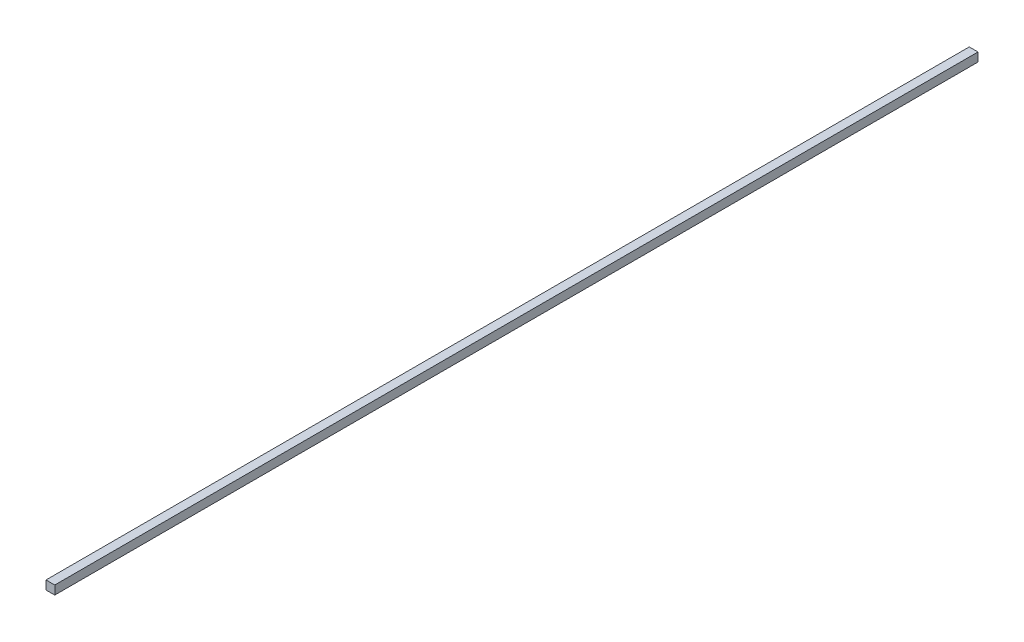
ISO-10303-21;
HEADER;
FILE_DESCRIPTION(('STEP AP214'),'2;1');
FILE_NAME('part.step','',(''),(''),'','','');
FILE_SCHEMA(('AUTOMOTIVE_DESIGN { 1 0 10303 214 1 1 1 1 }'));
ENDSEC;
DATA;
#1=APPLICATION_CONTEXT('core data for automotive mechanical design processes');
#2=APPLICATION_PROTOCOL_DEFINITION('international standard','automotive_design',2000,#1);
#3=PRODUCT_CONTEXT('',#1,'mechanical');
#4=PRODUCT('Part','Part','',(#3));
#5=PRODUCT_RELATED_PRODUCT_CATEGORY('part','',(#4));
#6=PRODUCT_DEFINITION_FORMATION('','',#4);
#7=PRODUCT_DEFINITION_CONTEXT('part definition',#1,'design');
#8=PRODUCT_DEFINITION('design','',#6,#7);
#9=PRODUCT_DEFINITION_SHAPE('','',#8);
#10=(LENGTH_UNIT() NAMED_UNIT(*) SI_UNIT(.MILLI.,.METRE.));
#11=(NAMED_UNIT(*) PLANE_ANGLE_UNIT() SI_UNIT($,.RADIAN.));
#12=(NAMED_UNIT(*) SI_UNIT($,.STERADIAN.) SOLID_ANGLE_UNIT());
#13=UNCERTAINTY_MEASURE_WITH_UNIT(LENGTH_MEASURE(1.E-05),#10,'distance_accuracy_value','');
#14=(GEOMETRIC_REPRESENTATION_CONTEXT(3) GLOBAL_UNCERTAINTY_ASSIGNED_CONTEXT((#13)) GLOBAL_UNIT_ASSIGNED_CONTEXT((#10,
#11,#12)) REPRESENTATION_CONTEXT('',''));
#15=CARTESIAN_POINT('',(0.,0.,0.));
#16=DIRECTION('',(0.,0.,1.));
#17=DIRECTION('',(1.,0.,0.));
#18=AXIS2_PLACEMENT_3D('',#15,#16,#17);
#19=CARTESIAN_POINT('',(-2.00000000000271,-43.6390849562708,211.));
#20=DIRECTION('',(0.,1.,0.));
#21=DIRECTION('',(0.,0.,1.));
#22=AXIS2_PLACEMENT_3D('',#19,#20,#21);
#23=PLANE('',#22);
#24=DIRECTION('',(1.,0.,0.));
#25=VECTOR('',#24,1.);
#26=CARTESIAN_POINT('',(-2.00000000000271,-43.6390849562708,0.));
#27=LINE('',#26,#25);
#28=CARTESIAN_POINT('',(-2.00000000000271,-43.6390849562708,0.));
#29=VERTEX_POINT('',#28);
#30=CARTESIAN_POINT('',(-2.71267383555873E-12,-43.6390849562708,0.));
#31=VERTEX_POINT('',#30);
#32=EDGE_CURVE('E95',#29,#31,#27,.T.);
#33=ORIENTED_EDGE('',*,*,#32,.T.);
#34=DIRECTION('',(0.,0.,-1.));
#35=VECTOR('',#34,1.);
#36=CARTESIAN_POINT('',(-2.71267383555873E-12,-43.6390849562708,211.));
#37=LINE('',#36,#35);
#38=CARTESIAN_POINT('',(-2.71267383555873E-12,-43.6390849562708,211.));
#39=VERTEX_POINT('',#38);
#40=EDGE_CURVE('E11',#39,#31,#37,.T.);
#41=ORIENTED_EDGE('',*,*,#40,.F.);
#42=DIRECTION('',(1.,0.,0.));
#43=VECTOR('',#42,1.);
#44=CARTESIAN_POINT('',(-2.00000000000271,-43.6390849562708,211.));
#45=LINE('',#44,#43);
#46=CARTESIAN_POINT('',(-2.00000000000271,-43.6390849562708,211.));
#47=VERTEX_POINT('',#46);
#48=EDGE_CURVE('E83',#47,#39,#45,.T.);
#49=ORIENTED_EDGE('',*,*,#48,.F.);
#50=DIRECTION('',(0.,0.,-1.));
#51=VECTOR('',#50,1.);
#52=CARTESIAN_POINT('',(-2.00000000000271,-43.6390849562708,211.));
#53=LINE('',#52,#51);
#54=EDGE_CURVE('E91',#47,#29,#53,.T.);
#55=ORIENTED_EDGE('',*,*,#54,.T.);
#56=EDGE_LOOP('',(#33,#41,#49,#55));
#57=FACE_BOUND('',#56,.T.);
#58=ADVANCED_FACE('F32',(#57),#23,.F.);
#59=CARTESIAN_POINT('',(-2.71267383555873E-12,-43.6390849562708,211.));
#60=DIRECTION('',(-1.,0.,0.));
#61=DIRECTION('',(0.,0.,1.));
#62=AXIS2_PLACEMENT_3D('',#59,#60,#61);
#63=PLANE('',#62);
#64=DIRECTION('',(0.,1.,0.));
#65=VECTOR('',#64,1.);
#66=CARTESIAN_POINT('',(-2.71267383555873E-12,-43.6390849562708,0.));
#67=LINE('',#66,#65);
#68=CARTESIAN_POINT('',(-2.71267383555873E-12,-41.6390849562708,0.));
#69=VERTEX_POINT('',#68);
#70=EDGE_CURVE('E87',#31,#69,#67,.T.);
#71=ORIENTED_EDGE('',*,*,#70,.T.);
#72=DIRECTION('',(0.,0.,-1.));
#73=VECTOR('',#72,1.);
#74=CARTESIAN_POINT('',(-2.71267383555873E-12,-41.6390849562708,211.));
#75=LINE('',#74,#73);
#76=CARTESIAN_POINT('',(-2.71267383555873E-12,-41.6390849562708,211.));
#77=VERTEX_POINT('',#76);
#78=EDGE_CURVE('E40',#77,#69,#75,.T.);
#79=ORIENTED_EDGE('',*,*,#78,.F.);
#80=DIRECTION('',(0.,1.,0.));
#81=VECTOR('',#80,1.);
#82=CARTESIAN_POINT('',(-2.71267383555873E-12,-43.6390849562708,211.));
#83=LINE('',#82,#81);
#84=EDGE_CURVE('E78',#39,#77,#83,.T.);
#85=ORIENTED_EDGE('',*,*,#84,.F.);
#86=ORIENTED_EDGE('',*,*,#40,.T.);
#87=EDGE_LOOP('',(#71,#79,#85,#86));
#88=FACE_BOUND('',#87,.T.);
#89=ADVANCED_FACE('F86',(#88),#63,.F.);
#90=CARTESIAN_POINT('',(-2.71267383555873E-12,-41.6390849562708,211.));
#91=DIRECTION('',(0.,-1.,0.));
#92=DIRECTION('',(0.,0.,-1.));
#93=AXIS2_PLACEMENT_3D('',#90,#91,#92);
#94=PLANE('',#93);
#95=DIRECTION('',(-1.,0.,0.));
#96=VECTOR('',#95,1.);
#97=CARTESIAN_POINT('',(-2.71267383555873E-12,-41.6390849562708,0.));
#98=LINE('',#97,#96);
#99=CARTESIAN_POINT('',(-2.00000000000271,-41.6390849562708,0.));
#100=VERTEX_POINT('',#99);
#101=EDGE_CURVE('E65',#69,#100,#98,.T.);
#102=ORIENTED_EDGE('',*,*,#101,.T.);
#103=DIRECTION('',(0.,0.,-1.));
#104=VECTOR('',#103,1.);
#105=CARTESIAN_POINT('',(-2.00000000000271,-41.6390849562708,211.));
#106=LINE('',#105,#104);
#107=CARTESIAN_POINT('',(-2.00000000000271,-41.6390849562708,211.));
#108=VERTEX_POINT('',#107);
#109=EDGE_CURVE('E88',#108,#100,#106,.T.);
#110=ORIENTED_EDGE('',*,*,#109,.F.);
#111=DIRECTION('',(-1.,0.,0.));
#112=VECTOR('',#111,1.);
#113=CARTESIAN_POINT('',(-2.71267383555873E-12,-41.6390849562708,211.));
#114=LINE('',#113,#112);
#115=EDGE_CURVE('E81',#77,#108,#114,.T.);
#116=ORIENTED_EDGE('',*,*,#115,.F.);
#117=ORIENTED_EDGE('',*,*,#78,.T.);
#118=EDGE_LOOP('',(#102,#110,#116,#117));
#119=FACE_BOUND('',#118,.T.);
#120=ADVANCED_FACE('F89',(#119),#94,.F.);
#121=CARTESIAN_POINT('',(-2.00000000000271,-41.6390849562708,211.));
#122=DIRECTION('',(1.,0.,0.));
#123=DIRECTION('',(0.,0.,-1.));
#124=AXIS2_PLACEMENT_3D('',#121,#122,#123);
#125=PLANE('',#124);
#126=DIRECTION('',(0.,-1.,0.));
#127=VECTOR('',#126,1.);
#128=CARTESIAN_POINT('',(-2.00000000000271,-41.6390849562708,0.));
#129=LINE('',#128,#127);
#130=EDGE_CURVE('E71',#100,#29,#129,.T.);
#131=ORIENTED_EDGE('',*,*,#130,.T.);
#132=ORIENTED_EDGE('',*,*,#54,.F.);
#133=DIRECTION('',(0.,-1.,0.));
#134=VECTOR('',#133,1.);
#135=CARTESIAN_POINT('',(-2.00000000000271,-41.6390849562708,211.));
#136=LINE('',#135,#134);
#137=EDGE_CURVE('E48',#108,#47,#136,.T.);
#138=ORIENTED_EDGE('',*,*,#137,.F.);
#139=ORIENTED_EDGE('',*,*,#109,.T.);
#140=EDGE_LOOP('',(#131,#132,#138,#139));
#141=FACE_BOUND('',#140,.T.);
#142=ADVANCED_FACE('F102',(#141),#125,.F.);
#143=CARTESIAN_POINT('',(0.,0.,211.));
#144=DIRECTION('',(0.,0.,1.));
#145=DIRECTION('',(1.,0.,0.));
#146=AXIS2_PLACEMENT_3D('',#143,#144,#145);
#147=PLANE('',#146);
#148=ORIENTED_EDGE('',*,*,#48,.T.);
#149=ORIENTED_EDGE('',*,*,#84,.T.);
#150=ORIENTED_EDGE('',*,*,#115,.T.);
#151=ORIENTED_EDGE('',*,*,#137,.T.);
#152=EDGE_LOOP('',(#148,#149,#150,#151));
#153=FACE_BOUND('',#152,.T.);
#154=ADVANCED_FACE('F79',(#153),#147,.T.);
#155=CARTESIAN_POINT('',(0.,0.,0.));
#156=DIRECTION('',(0.,0.,1.));
#157=DIRECTION('',(1.,0.,0.));
#158=AXIS2_PLACEMENT_3D('',#155,#156,#157);
#159=PLANE('',#158);
#160=ORIENTED_EDGE('',*,*,#32,.F.);
#161=ORIENTED_EDGE('',*,*,#130,.F.);
#162=ORIENTED_EDGE('',*,*,#101,.F.);
#163=ORIENTED_EDGE('',*,*,#70,.F.);
#164=EDGE_LOOP('',(#160,#161,#162,#163));
#165=FACE_BOUND('',#164,.T.);
#166=ADVANCED_FACE('F105',(#165),#159,.F.);
#167=CLOSED_SHELL('',(#58,#89,#120,#142,#154,#166));
#168=MANIFOLD_SOLID_BREP('B2',#167);
#169=ADVANCED_BREP_SHAPE_REPRESENTATION('',(#18,#168),#14);
#170=SHAPE_DEFINITION_REPRESENTATION(#9,#169);
ENDSEC;
END-ISO-10303-21;
